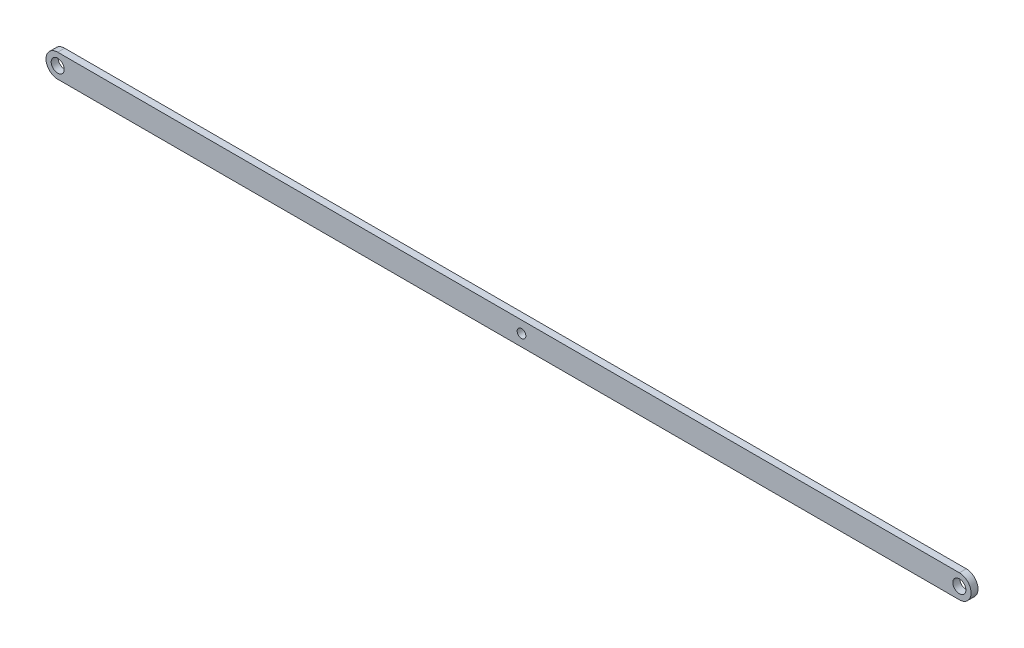
ISO-10303-21;
HEADER;
FILE_DESCRIPTION(('STEP AP214'),'2;1');
FILE_NAME('part.step','',(''),(''),'','','');
FILE_SCHEMA(('AUTOMOTIVE_DESIGN { 1 0 10303 214 1 1 1 1 }'));
ENDSEC;
DATA;
#1=APPLICATION_CONTEXT('core data for automotive mechanical design processes');
#2=APPLICATION_PROTOCOL_DEFINITION('international standard','automotive_design',2000,#1);
#3=PRODUCT_CONTEXT('',#1,'mechanical');
#4=PRODUCT('Part','Part','',(#3));
#5=PRODUCT_RELATED_PRODUCT_CATEGORY('part','',(#4));
#6=PRODUCT_DEFINITION_FORMATION('','',#4);
#7=PRODUCT_DEFINITION_CONTEXT('part definition',#1,'design');
#8=PRODUCT_DEFINITION('design','',#6,#7);
#9=PRODUCT_DEFINITION_SHAPE('','',#8);
#10=(LENGTH_UNIT() NAMED_UNIT(*) SI_UNIT(.MILLI.,.METRE.));
#11=(NAMED_UNIT(*) PLANE_ANGLE_UNIT() SI_UNIT($,.RADIAN.));
#12=(NAMED_UNIT(*) SI_UNIT($,.STERADIAN.) SOLID_ANGLE_UNIT());
#13=UNCERTAINTY_MEASURE_WITH_UNIT(LENGTH_MEASURE(1.E-05),#10,'distance_accuracy_value','');
#14=(GEOMETRIC_REPRESENTATION_CONTEXT(3) GLOBAL_UNCERTAINTY_ASSIGNED_CONTEXT((#13)) GLOBAL_UNIT_ASSIGNED_CONTEXT((#10,
#11,#12)) REPRESENTATION_CONTEXT('',''));
#15=CARTESIAN_POINT('',(0.,0.,0.));
#16=DIRECTION('',(0.,0.,1.));
#17=DIRECTION('',(1.,0.,0.));
#18=AXIS2_PLACEMENT_3D('',#15,#16,#17);
#19=CARTESIAN_POINT('',(-3250.,0.,50.));
#20=DIRECTION('',(0.,0.,1.));
#21=DIRECTION('',(1.,0.,0.));
#22=AXIS2_PLACEMENT_3D('',#19,#20,#21);
#23=PLANE('',#22);
#24=CARTESIAN_POINT('',(93.4186272437274,6.14178542486721E-13,50.));
#25=DIRECTION('',(0.,0.,1.));
#26=DIRECTION('',(1.,0.,0.));
#27=AXIS2_PLACEMENT_3D('',#24,#25,#26);
#28=CIRCLE('',#27,31.25);
#29=CARTESIAN_POINT('',(124.668627243727,6.14178542486721E-13,50.));
#30=VERTEX_POINT('',#29);
#31=EDGE_CURVE('E117',#30,#30,#28,.T.);
#32=ORIENTED_EDGE('',*,*,#31,.F.);
#33=EDGE_LOOP('',(#32));
#34=FACE_BOUND('',#33,.T.);
#35=CARTESIAN_POINT('',(-3250.,0.,50.));
#36=DIRECTION('',(0.,0.,1.));
#37=DIRECTION('',(1.,0.,0.));
#38=AXIS2_PLACEMENT_3D('',#35,#36,#37);
#39=CIRCLE('',#38,84.375);
#40=CARTESIAN_POINT('',(-3250.,84.375,50.));
#41=VERTEX_POINT('',#40);
#42=CARTESIAN_POINT('',(-3250.,-84.375,50.));
#43=VERTEX_POINT('',#42);
#44=EDGE_CURVE('E87',#41,#43,#39,.T.);
#45=ORIENTED_EDGE('',*,*,#44,.T.);
#46=DIRECTION('',(1.,0.,0.));
#47=VECTOR('',#46,1.);
#48=CARTESIAN_POINT('',(-3250.,-84.375,50.));
#49=LINE('',#48,#47);
#50=CARTESIAN_POINT('',(3250.,-84.3749999999988,50.));
#51=VERTEX_POINT('',#50);
#52=EDGE_CURVE('E82',#43,#51,#49,.T.);
#53=ORIENTED_EDGE('',*,*,#52,.T.);
#54=CARTESIAN_POINT('',(3250.,1.19403062916867E-12,50.));
#55=DIRECTION('',(0.,0.,1.));
#56=DIRECTION('',(1.,0.,0.));
#57=AXIS2_PLACEMENT_3D('',#54,#55,#56);
#58=CIRCLE('',#57,84.375);
#59=CARTESIAN_POINT('',(3250.,84.3750000000012,50.));
#60=VERTEX_POINT('',#59);
#61=EDGE_CURVE('E85',#51,#60,#58,.T.);
#62=ORIENTED_EDGE('',*,*,#61,.T.);
#63=DIRECTION('',(-1.,0.,0.));
#64=VECTOR('',#63,1.);
#65=CARTESIAN_POINT('',(-3250.,84.375,50.));
#66=LINE('',#65,#64);
#67=EDGE_CURVE('E52',#60,#41,#66,.T.);
#68=ORIENTED_EDGE('',*,*,#67,.T.);
#69=EDGE_LOOP('',(#45,#53,#62,#68));
#70=FACE_BOUND('',#69,.T.);
#71=CARTESIAN_POINT('',(-3250.,0.,50.));
#72=DIRECTION('',(0.,0.,1.));
#73=DIRECTION('',(1.,0.,0.));
#74=AXIS2_PLACEMENT_3D('',#71,#72,#73);
#75=CIRCLE('',#74,46.8749999999999);
#76=CARTESIAN_POINT('',(-3203.125,0.,50.));
#77=VERTEX_POINT('',#76);
#78=EDGE_CURVE('E102',#77,#77,#75,.T.);
#79=ORIENTED_EDGE('',*,*,#78,.F.);
#80=EDGE_LOOP('',(#79));
#81=FACE_BOUND('',#80,.T.);
#82=CARTESIAN_POINT('',(3250.,1.19403062916867E-12,50.));
#83=DIRECTION('',(0.,0.,1.));
#84=DIRECTION('',(1.,0.,0.));
#85=AXIS2_PLACEMENT_3D('',#82,#83,#84);
#86=CIRCLE('',#85,46.8750000000003);
#87=CARTESIAN_POINT('',(3296.875,1.19403062916867E-12,50.));
#88=VERTEX_POINT('',#87);
#89=EDGE_CURVE('E123',#88,#88,#86,.T.);
#90=ORIENTED_EDGE('',*,*,#89,.F.);
#91=EDGE_LOOP('',(#90));
#92=FACE_BOUND('',#91,.T.);
#93=ADVANCED_FACE('F35',(#34,#70,#81,#92),#23,.T.);
#94=CARTESIAN_POINT('',(-3250.,0.,0.));
#95=DIRECTION('',(0.,0.,1.));
#96=DIRECTION('',(1.,0.,0.));
#97=AXIS2_PLACEMENT_3D('',#94,#95,#96);
#98=PLANE('',#97);
#99=CARTESIAN_POINT('',(93.4186272437274,6.14178542486721E-13,0.));
#100=DIRECTION('',(0.,0.,1.));
#101=DIRECTION('',(1.,0.,0.));
#102=AXIS2_PLACEMENT_3D('',#99,#100,#101);
#103=CIRCLE('',#102,31.25);
#104=CARTESIAN_POINT('',(124.668627243727,6.14178542486721E-13,0.));
#105=VERTEX_POINT('',#104);
#106=EDGE_CURVE('E120',#105,#105,#103,.T.);
#107=ORIENTED_EDGE('',*,*,#106,.T.);
#108=EDGE_LOOP('',(#107));
#109=FACE_BOUND('',#108,.T.);
#110=CARTESIAN_POINT('',(-3250.,0.,0.));
#111=DIRECTION('',(0.,0.,1.));
#112=DIRECTION('',(1.,0.,0.));
#113=AXIS2_PLACEMENT_3D('',#110,#111,#112);
#114=CIRCLE('',#113,84.375);
#115=CARTESIAN_POINT('',(-3250.,84.375,0.));
#116=VERTEX_POINT('',#115);
#117=CARTESIAN_POINT('',(-3250.,-84.375,0.));
#118=VERTEX_POINT('',#117);
#119=EDGE_CURVE('E99',#116,#118,#114,.T.);
#120=ORIENTED_EDGE('',*,*,#119,.F.);
#121=DIRECTION('',(-1.,0.,0.));
#122=VECTOR('',#121,1.);
#123=CARTESIAN_POINT('',(-3250.,84.375,0.));
#124=LINE('',#123,#122);
#125=CARTESIAN_POINT('',(3250.,84.3750000000012,0.));
#126=VERTEX_POINT('',#125);
#127=EDGE_CURVE('E75',#126,#116,#124,.T.);
#128=ORIENTED_EDGE('',*,*,#127,.F.);
#129=CARTESIAN_POINT('',(3250.,1.19403062916867E-12,0.));
#130=DIRECTION('',(0.,0.,1.));
#131=DIRECTION('',(1.,0.,0.));
#132=AXIS2_PLACEMENT_3D('',#129,#130,#131);
#133=CIRCLE('',#132,84.375);
#134=CARTESIAN_POINT('',(3250.,-84.3749999999988,0.));
#135=VERTEX_POINT('',#134);
#136=EDGE_CURVE('E69',#135,#126,#133,.T.);
#137=ORIENTED_EDGE('',*,*,#136,.F.);
#138=DIRECTION('',(1.,0.,0.));
#139=VECTOR('',#138,1.);
#140=CARTESIAN_POINT('',(-3250.,-84.375,0.));
#141=LINE('',#140,#139);
#142=EDGE_CURVE('E91',#118,#135,#141,.T.);
#143=ORIENTED_EDGE('',*,*,#142,.F.);
#144=EDGE_LOOP('',(#120,#128,#137,#143));
#145=FACE_BOUND('',#144,.T.);
#146=CARTESIAN_POINT('',(-3250.,0.,0.));
#147=DIRECTION('',(0.,0.,1.));
#148=DIRECTION('',(1.,0.,0.));
#149=AXIS2_PLACEMENT_3D('',#146,#147,#148);
#150=CIRCLE('',#149,46.8749999999999);
#151=CARTESIAN_POINT('',(-3203.125,0.,0.));
#152=VERTEX_POINT('',#151);
#153=EDGE_CURVE('E114',#152,#152,#150,.T.);
#154=ORIENTED_EDGE('',*,*,#153,.T.);
#155=EDGE_LOOP('',(#154));
#156=FACE_BOUND('',#155,.T.);
#157=CARTESIAN_POINT('',(3250.,1.19403062916867E-12,0.));
#158=DIRECTION('',(0.,0.,1.));
#159=DIRECTION('',(1.,0.,0.));
#160=AXIS2_PLACEMENT_3D('',#157,#158,#159);
#161=CIRCLE('',#160,46.8750000000003);
#162=CARTESIAN_POINT('',(3296.875,1.19403062916867E-12,0.));
#163=VERTEX_POINT('',#162);
#164=EDGE_CURVE('E126',#163,#163,#161,.T.);
#165=ORIENTED_EDGE('',*,*,#164,.T.);
#166=EDGE_LOOP('',(#165));
#167=FACE_BOUND('',#166,.T.);
#168=ADVANCED_FACE('F110',(#109,#145,#156,#167),#98,.F.);
#169=CARTESIAN_POINT('',(-3250.,0.,50.));
#170=DIRECTION('',(0.,0.,-1.));
#171=DIRECTION('',(-1.,0.,0.));
#172=AXIS2_PLACEMENT_3D('',#169,#170,#171);
#173=CYLINDRICAL_SURFACE('',#172,84.375);
#174=ORIENTED_EDGE('',*,*,#119,.T.);
#175=DIRECTION('',(0.,0.,-1.));
#176=VECTOR('',#175,1.);
#177=CARTESIAN_POINT('',(-3250.,-84.375,50.));
#178=LINE('',#177,#176);
#179=EDGE_CURVE('E11',#43,#118,#178,.T.);
#180=ORIENTED_EDGE('',*,*,#179,.F.);
#181=ORIENTED_EDGE('',*,*,#44,.F.);
#182=DIRECTION('',(0.,0.,-1.));
#183=VECTOR('',#182,1.);
#184=CARTESIAN_POINT('',(-3250.,84.375,50.));
#185=LINE('',#184,#183);
#186=EDGE_CURVE('E95',#41,#116,#185,.T.);
#187=ORIENTED_EDGE('',*,*,#186,.T.);
#188=EDGE_LOOP('',(#174,#180,#181,#187));
#189=FACE_BOUND('',#188,.T.);
#190=ADVANCED_FACE('F37',(#189),#173,.T.);
#191=CARTESIAN_POINT('',(-3250.,-84.375,50.));
#192=DIRECTION('',(0.,1.,0.));
#193=DIRECTION('',(-1.,0.,0.));
#194=AXIS2_PLACEMENT_3D('',#191,#192,#193);
#195=PLANE('',#194);
#196=ORIENTED_EDGE('',*,*,#142,.T.);
#197=DIRECTION('',(0.,0.,-1.));
#198=VECTOR('',#197,1.);
#199=CARTESIAN_POINT('',(3250.,-84.3749999999988,50.));
#200=LINE('',#199,#198);
#201=EDGE_CURVE('E44',#51,#135,#200,.T.);
#202=ORIENTED_EDGE('',*,*,#201,.F.);
#203=ORIENTED_EDGE('',*,*,#52,.F.);
#204=ORIENTED_EDGE('',*,*,#179,.T.);
#205=EDGE_LOOP('',(#196,#202,#203,#204));
#206=FACE_BOUND('',#205,.T.);
#207=ADVANCED_FACE('F90',(#206),#195,.F.);
#208=CARTESIAN_POINT('',(3250.,1.19403062916867E-12,50.));
#209=DIRECTION('',(0.,0.,-1.));
#210=DIRECTION('',(-1.,0.,0.));
#211=AXIS2_PLACEMENT_3D('',#208,#209,#210);
#212=CYLINDRICAL_SURFACE('',#211,84.375);
#213=ORIENTED_EDGE('',*,*,#136,.T.);
#214=DIRECTION('',(0.,0.,-1.));
#215=VECTOR('',#214,1.);
#216=CARTESIAN_POINT('',(3250.,84.3750000000012,50.));
#217=LINE('',#216,#215);
#218=EDGE_CURVE('E92',#60,#126,#217,.T.);
#219=ORIENTED_EDGE('',*,*,#218,.F.);
#220=ORIENTED_EDGE('',*,*,#61,.F.);
#221=ORIENTED_EDGE('',*,*,#201,.T.);
#222=EDGE_LOOP('',(#213,#219,#220,#221));
#223=FACE_BOUND('',#222,.T.);
#224=ADVANCED_FACE('F93',(#223),#212,.T.);
#225=CARTESIAN_POINT('',(-3250.,84.375,50.));
#226=DIRECTION('',(0.,-1.,0.));
#227=DIRECTION('',(1.,0.,0.));
#228=AXIS2_PLACEMENT_3D('',#225,#226,#227);
#229=PLANE('',#228);
#230=ORIENTED_EDGE('',*,*,#127,.T.);
#231=ORIENTED_EDGE('',*,*,#186,.F.);
#232=ORIENTED_EDGE('',*,*,#67,.F.);
#233=ORIENTED_EDGE('',*,*,#218,.T.);
#234=EDGE_LOOP('',(#230,#231,#232,#233));
#235=FACE_BOUND('',#234,.T.);
#236=ADVANCED_FACE('F107',(#235),#229,.F.);
#237=CARTESIAN_POINT('',(-3250.,0.,50.));
#238=DIRECTION('',(0.,0.,-1.));
#239=DIRECTION('',(-1.,0.,0.));
#240=AXIS2_PLACEMENT_3D('',#237,#238,#239);
#241=CYLINDRICAL_SURFACE('',#240,46.8749999999999);
#242=ORIENTED_EDGE('',*,*,#78,.T.);
#243=EDGE_LOOP('',(#242));
#244=FACE_BOUND('',#243,.T.);
#245=ORIENTED_EDGE('',*,*,#153,.F.);
#246=EDGE_LOOP('',(#245));
#247=FACE_BOUND('',#246,.T.);
#248=ADVANCED_FACE('F145',(#244,#247),#241,.F.);
#249=CARTESIAN_POINT('',(93.4186272437274,6.14178542486721E-13,50.));
#250=DIRECTION('',(0.,0.,-1.));
#251=DIRECTION('',(-1.,0.,0.));
#252=AXIS2_PLACEMENT_3D('',#249,#250,#251);
#253=CYLINDRICAL_SURFACE('',#252,31.25);
#254=ORIENTED_EDGE('',*,*,#31,.T.);
#255=EDGE_LOOP('',(#254));
#256=FACE_BOUND('',#255,.T.);
#257=ORIENTED_EDGE('',*,*,#106,.F.);
#258=EDGE_LOOP('',(#257));
#259=FACE_BOUND('',#258,.T.);
#260=ADVANCED_FACE('F191',(#256,#259),#253,.F.);
#261=CARTESIAN_POINT('',(3250.,1.19403062916867E-12,50.));
#262=DIRECTION('',(0.,0.,-1.));
#263=DIRECTION('',(-1.,0.,0.));
#264=AXIS2_PLACEMENT_3D('',#261,#262,#263);
#265=CYLINDRICAL_SURFACE('',#264,46.8750000000003);
#266=ORIENTED_EDGE('',*,*,#89,.T.);
#267=EDGE_LOOP('',(#266));
#268=FACE_BOUND('',#267,.T.);
#269=ORIENTED_EDGE('',*,*,#164,.F.);
#270=EDGE_LOOP('',(#269));
#271=FACE_BOUND('',#270,.T.);
#272=ADVANCED_FACE('F132',(#268,#271),#265,.F.);
#273=CLOSED_SHELL('',(#93,#168,#190,#207,#224,#236,#248,#260,#272));
#274=MANIFOLD_SOLID_BREP('B2',#273);
#275=ADVANCED_BREP_SHAPE_REPRESENTATION('',(#18,#274),#14);
#276=SHAPE_DEFINITION_REPRESENTATION(#9,#275);
ENDSEC;
END-ISO-10303-21;
